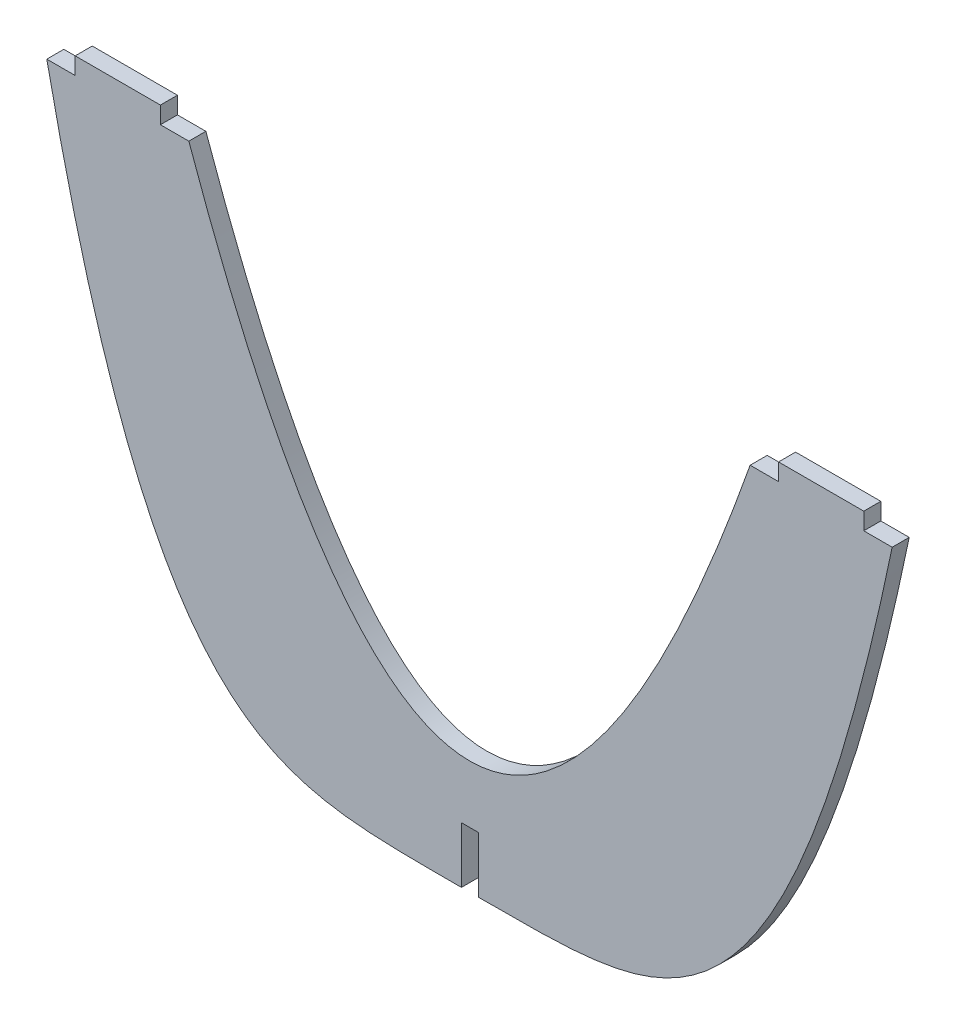
ISO-10303-21;
HEADER;
FILE_DESCRIPTION(('STEP AP214'),'2;1');
FILE_NAME('part.step','',(''),(''),'','','');
FILE_SCHEMA(('AUTOMOTIVE_DESIGN { 1 0 10303 214 1 1 1 1 }'));
ENDSEC;
DATA;
#1=APPLICATION_CONTEXT('core data for automotive mechanical design processes');
#2=APPLICATION_PROTOCOL_DEFINITION('international standard','automotive_design',2000,#1);
#3=PRODUCT_CONTEXT('',#1,'mechanical');
#4=PRODUCT('Part','Part','',(#3));
#5=PRODUCT_RELATED_PRODUCT_CATEGORY('part','',(#4));
#6=PRODUCT_DEFINITION_FORMATION('','',#4);
#7=PRODUCT_DEFINITION_CONTEXT('part definition',#1,'design');
#8=PRODUCT_DEFINITION('design','',#6,#7);
#9=PRODUCT_DEFINITION_SHAPE('','',#8);
#10=(LENGTH_UNIT() NAMED_UNIT(*) SI_UNIT(.MILLI.,.METRE.));
#11=(NAMED_UNIT(*) PLANE_ANGLE_UNIT() SI_UNIT($,.RADIAN.));
#12=(NAMED_UNIT(*) SI_UNIT($,.STERADIAN.) SOLID_ANGLE_UNIT());
#13=UNCERTAINTY_MEASURE_WITH_UNIT(LENGTH_MEASURE(1.E-05),#10,'distance_accuracy_value','');
#14=(GEOMETRIC_REPRESENTATION_CONTEXT(3) GLOBAL_UNCERTAINTY_ASSIGNED_CONTEXT((#13)) GLOBAL_UNIT_ASSIGNED_CONTEXT((#10,
#11,#12)) REPRESENTATION_CONTEXT('',''));
#15=CARTESIAN_POINT('',(0.,0.,0.));
#16=DIRECTION('',(0.,0.,1.));
#17=DIRECTION('',(1.,0.,0.));
#18=AXIS2_PLACEMENT_3D('',#15,#16,#17);
#19=CARTESIAN_POINT('',(-74.4818730679932,89.7662411822127,3.));
#20=CARTESIAN_POINT('',(-37.281873072068,-89.7662411619835,3.));
#21=CARTESIAN_POINT('',(-0.0818730801667343,89.766241141636,3.));
#22=CARTESIAN_POINT('',(37.1181269157585,-89.7662411197392,3.));
#23=CARTESIAN_POINT('',(74.3181269076597,89.7662411010596,3.));
#24=B_SPLINE_CURVE_WITH_KNOTS('',4,(#19,#20,#21,#22,#23),.UNSPECIFIED.,.F.,.F.,(5,5),
(0.0307884857871394,0.969211514104634),.UNSPECIFIED.);
#25=DIRECTION('',(0.,0.,-1.));
#26=VECTOR('',#25,1.);
#27=SURFACE_OF_LINEAR_EXTRUSION('',#24,#26);
#28=DIRECTION('',(0.,0.,1.));
#29=VECTOR('',#28,1.);
#30=CARTESIAN_POINT('',(1.50000000000001,1.83449874206418E-05,-7.));
#31=LINE('',#30,#29);
#32=CARTESIAN_POINT('',(1.50000000000001,1.83449874206418E-05,0.));
#33=VERTEX_POINT('',#32);
#34=CARTESIAN_POINT('',(1.50000000000001,1.83449874206418E-05,3.));
#35=VERTEX_POINT('',#34);
#36=EDGE_CURVE('E59',#33,#35,#31,.T.);
#37=ORIENTED_EDGE('',*,*,#36,.F.);
#38=CARTESIAN_POINT('',(-74.4818730679932,89.7662411822127,0.));
#39=CARTESIAN_POINT('',(-37.281873072068,-89.7662411619835,0.));
#40=CARTESIAN_POINT('',(-0.0818730801667343,89.766241141636,0.));
#41=CARTESIAN_POINT('',(37.1181269157585,-89.7662411197392,0.));
#42=CARTESIAN_POINT('',(74.3181269076597,89.7662411010596,0.));
#43=B_SPLINE_CURVE_WITH_KNOTS('',4,(#38,#39,#40,#41,#42),.UNSPECIFIED.,.F.,.F.,(5,5),
(0.0307884857871394,0.969211514104634),.UNSPECIFIED.);
#44=CARTESIAN_POINT('',(74.3181269080053,89.7662411027273,0.));
#45=VERTEX_POINT('',#44);
#46=EDGE_CURVE('E50',#33,#45,#43,.T.);
#47=ORIENTED_EDGE('',*,*,#46,.T.);
#48=DIRECTION('',(0.,0.,-1.));
#49=VECTOR('',#48,1.);
#50=CARTESIAN_POINT('',(74.3181269080053,89.7662411027273,3.));
#51=LINE('',#50,#49);
#52=CARTESIAN_POINT('',(74.3181269080053,89.7662411027273,3.));
#53=VERTEX_POINT('',#52);
#54=EDGE_CURVE('E378',#53,#45,#51,.T.);
#55=ORIENTED_EDGE('',*,*,#54,.F.);
#56=EDGE_CURVE('E318',#35,#53,#24,.T.);
#57=ORIENTED_EDGE('',*,*,#56,.F.);
#58=EDGE_LOOP('',(#37,#47,#55,#57));
#59=FACE_BOUND('',#58,.T.);
#60=ADVANCED_FACE('F45',(#59),#27,.F.);
#61=CARTESIAN_POINT('',(0.,0.,3.));
#62=DIRECTION('',(0.,0.,1.));
#63=DIRECTION('',(1.,0.,0.));
#64=AXIS2_PLACEMENT_3D('',#61,#62,#63);
#65=PLANE('',#64);
#66=DIRECTION('',(0.,1.,0.));
#67=VECTOR('',#66,1.);
#68=CARTESIAN_POINT('',(1.5,9.87001834498743,3.));
#69=LINE('',#68,#67);
#70=CARTESIAN_POINT('',(1.5,9.87001834498743,3.));
#71=VERTEX_POINT('',#70);
#72=EDGE_CURVE('E11',#35,#71,#69,.T.);
#73=ORIENTED_EDGE('',*,*,#72,.F.);
#74=ORIENTED_EDGE('',*,*,#56,.T.);
#75=DIRECTION('',(-1.,0.,0.));
#76=VECTOR('',#75,1.);
#77=CARTESIAN_POINT('',(0.,89.7662411027273,3.));
#78=LINE('',#77,#76);
#79=CARTESIAN_POINT('',(69.3181269091355,89.7662411027273,3.));
#80=VERTEX_POINT('',#79);
#81=EDGE_CURVE('E323',#53,#80,#78,.T.);
#82=ORIENTED_EDGE('',*,*,#81,.T.);
#83=DIRECTION('',(0.,1.,0.));
#84=VECTOR('',#83,1.);
#85=CARTESIAN_POINT('',(69.3181269091355,0.,3.));
#86=LINE('',#85,#84);
#87=CARTESIAN_POINT('',(69.3181269091355,92.7662411361806,3.));
#88=VERTEX_POINT('',#87);
#89=EDGE_CURVE('E346',#80,#88,#86,.T.);
#90=ORIENTED_EDGE('',*,*,#89,.T.);
#91=DIRECTION('',(-1.,0.,0.));
#92=VECTOR('',#91,1.);
#93=CARTESIAN_POINT('',(0.,92.7662411361805,3.));
#94=LINE('',#93,#92);
#95=CARTESIAN_POINT('',(54.3181269152825,92.7662411361806,3.));
#96=VERTEX_POINT('',#95);
#97=EDGE_CURVE('E337',#88,#96,#94,.T.);
#98=ORIENTED_EDGE('',*,*,#97,.T.);
#99=DIRECTION('',(0.,-1.,0.));
#100=VECTOR('',#99,1.);
#101=CARTESIAN_POINT('',(54.3181269152825,0.,3.));
#102=LINE('',#101,#100);
#103=CARTESIAN_POINT('',(54.3181269152825,89.7662411361806,3.));
#104=VERTEX_POINT('',#103);
#105=EDGE_CURVE('E334',#96,#104,#102,.T.);
#106=ORIENTED_EDGE('',*,*,#105,.T.);
#107=DIRECTION('',(-1.,0.,0.));
#108=VECTOR('',#107,1.);
#109=CARTESIAN_POINT('',(0.,89.7662411361806,3.));
#110=LINE('',#109,#108);
#111=CARTESIAN_POINT('',(49.3181269152825,89.7662411361806,3.));
#112=VERTEX_POINT('',#111);
#113=EDGE_CURVE('E192',#104,#112,#110,.T.);
#114=ORIENTED_EDGE('',*,*,#113,.T.);
#115=CARTESIAN_POINT('',(-49.4818730716867,89.7662412000382,3.));
#116=CARTESIAN_POINT('',(0.027191039267859,-49.7662839097448,3.));
#117=CARTESIAN_POINT('',(49.3181269152825,89.7662411361806,3.));
#118=B_SPLINE_CURVE_WITH_KNOTS('',2,(#115,#116,#117),.UNSPECIFIED.,.F.,.F.,(3,3),(0.,1.),.UNSPECIFIED.);
#119=CARTESIAN_POINT('',(-49.4818730716867,89.7662412000382,3.));
#120=VERTEX_POINT('',#119);
#121=EDGE_CURVE('E174',#120,#112,#118,.T.);
#122=ORIENTED_EDGE('',*,*,#121,.F.);
#123=DIRECTION('',(1.,0.,0.));
#124=VECTOR('',#123,1.);
#125=CARTESIAN_POINT('',(0.,89.7662412000382,3.));
#126=LINE('',#125,#124);
#127=CARTESIAN_POINT('',(-54.4818730716867,89.7662412000382,3.));
#128=VERTEX_POINT('',#127);
#129=EDGE_CURVE('E183',#128,#120,#126,.T.);
#130=ORIENTED_EDGE('',*,*,#129,.F.);
#131=DIRECTION('',(0.,-1.,0.));
#132=VECTOR('',#131,1.);
#133=CARTESIAN_POINT('',(-54.4818730716867,0.,3.));
#134=LINE('',#133,#132);
#135=CARTESIAN_POINT('',(-54.4818730716867,92.7662411833908,3.));
#136=VERTEX_POINT('',#135);
#137=EDGE_CURVE('E182',#136,#128,#134,.T.);
#138=ORIENTED_EDGE('',*,*,#137,.F.);
#139=DIRECTION('',(1.,0.,0.));
#140=VECTOR('',#139,1.);
#141=CARTESIAN_POINT('',(0.,92.7662411833908,3.));
#142=LINE('',#141,#140);
#143=CARTESIAN_POINT('',(-69.481873068232,92.7662411833908,3.));
#144=VERTEX_POINT('',#143);
#145=EDGE_CURVE('E360',#144,#136,#142,.T.);
#146=ORIENTED_EDGE('',*,*,#145,.F.);
#147=DIRECTION('',(0.,1.,0.));
#148=VECTOR('',#147,1.);
#149=CARTESIAN_POINT('',(-69.481873068232,0.,3.));
#150=LINE('',#149,#148);
#151=CARTESIAN_POINT('',(-69.481873068232,89.7662411821999,3.));
#152=VERTEX_POINT('',#151);
#153=EDGE_CURVE('E356',#152,#144,#150,.T.);
#154=ORIENTED_EDGE('',*,*,#153,.F.);
#155=DIRECTION('',(1.,0.,0.));
#156=VECTOR('',#155,1.);
#157=CARTESIAN_POINT('',(0.,89.7662411821999,3.));
#158=LINE('',#157,#156);
#159=CARTESIAN_POINT('',(-74.4818730679906,89.7662411821999,3.));
#160=VERTEX_POINT('',#159);
#161=EDGE_CURVE('E351',#160,#152,#158,.T.);
#162=ORIENTED_EDGE('',*,*,#161,.F.);
#163=CARTESIAN_POINT('',(-1.49999999999999,1.83449874202744E-05,3.));
#164=VERTEX_POINT('',#163);
#165=EDGE_CURVE('E328',#160,#164,#24,.T.);
#166=ORIENTED_EDGE('',*,*,#165,.T.);
#167=DIRECTION('',(0.,-1.,0.));
#168=VECTOR('',#167,1.);
#169=CARTESIAN_POINT('',(-1.5,9.87001834498743,3.));
#170=LINE('',#169,#168);
#171=CARTESIAN_POINT('',(-1.5,9.87001834498743,3.));
#172=VERTEX_POINT('',#171);
#173=EDGE_CURVE('E312',#172,#164,#170,.T.);
#174=ORIENTED_EDGE('',*,*,#173,.F.);
#175=DIRECTION('',(-1.,0.,0.));
#176=VECTOR('',#175,1.);
#177=CARTESIAN_POINT('',(-1.5,9.87001834498743,3.));
#178=LINE('',#177,#176);
#179=EDGE_CURVE('E309',#71,#172,#178,.T.);
#180=ORIENTED_EDGE('',*,*,#179,.F.);
#181=EDGE_LOOP('',(#73,#74,#82,#90,#98,#106,#114,#122,#130,#138,#146,#154,#162,#166,#174,#180));
#182=FACE_BOUND('',#181,.T.);
#183=ADVANCED_FACE('F188',(#182),#65,.T.);
#184=CARTESIAN_POINT('',(0.,0.,0.));
#185=DIRECTION('',(0.,0.,1.));
#186=DIRECTION('',(1.,0.,0.));
#187=AXIS2_PLACEMENT_3D('',#184,#185,#186);
#188=PLANE('',#187);
#189=ORIENTED_EDGE('',*,*,#46,.F.);
#190=DIRECTION('',(0.,1.,0.));
#191=VECTOR('',#190,1.);
#192=CARTESIAN_POINT('',(1.50000000000001,0.,0.));
#193=LINE('',#192,#191);
#194=CARTESIAN_POINT('',(1.5,9.87001834498743,0.));
#195=VERTEX_POINT('',#194);
#196=EDGE_CURVE('E68',#33,#195,#193,.T.);
#197=ORIENTED_EDGE('',*,*,#196,.T.);
#198=DIRECTION('',(-1.,0.,0.));
#199=VECTOR('',#198,1.);
#200=CARTESIAN_POINT('',(0.,9.87001834498743,0.));
#201=LINE('',#200,#199);
#202=CARTESIAN_POINT('',(-1.5,9.87001834498743,0.));
#203=VERTEX_POINT('',#202);
#204=EDGE_CURVE('E290',#195,#203,#201,.T.);
#205=ORIENTED_EDGE('',*,*,#204,.T.);
#206=DIRECTION('',(0.,-1.,0.));
#207=VECTOR('',#206,1.);
#208=CARTESIAN_POINT('',(-1.49999999999999,0.,0.));
#209=LINE('',#208,#207);
#210=CARTESIAN_POINT('',(-1.49999999999999,1.83449874202744E-05,0.));
#211=VERTEX_POINT('',#210);
#212=EDGE_CURVE('E91',#203,#211,#209,.T.);
#213=ORIENTED_EDGE('',*,*,#212,.T.);
#214=CARTESIAN_POINT('',(-74.4818730679906,89.7662411821999,0.));
#215=VERTEX_POINT('',#214);
#216=EDGE_CURVE('E279',#215,#211,#43,.T.);
#217=ORIENTED_EDGE('',*,*,#216,.F.);
#218=DIRECTION('',(1.,0.,0.));
#219=VECTOR('',#218,1.);
#220=CARTESIAN_POINT('',(0.,89.7662411821999,0.));
#221=LINE('',#220,#219);
#222=CARTESIAN_POINT('',(-69.481873068232,89.7662411821999,0.));
#223=VERTEX_POINT('',#222);
#224=EDGE_CURVE('E292',#215,#223,#221,.T.);
#225=ORIENTED_EDGE('',*,*,#224,.T.);
#226=DIRECTION('',(0.,1.,0.));
#227=VECTOR('',#226,1.);
#228=CARTESIAN_POINT('',(-69.481873068232,0.,0.));
#229=LINE('',#228,#227);
#230=CARTESIAN_POINT('',(-69.481873068232,92.7662411833908,0.));
#231=VERTEX_POINT('',#230);
#232=EDGE_CURVE('E296',#223,#231,#229,.T.);
#233=ORIENTED_EDGE('',*,*,#232,.T.);
#234=DIRECTION('',(1.,0.,0.));
#235=VECTOR('',#234,1.);
#236=CARTESIAN_POINT('',(0.,92.7662411833908,0.));
#237=LINE('',#236,#235);
#238=CARTESIAN_POINT('',(-54.4818730716867,92.7662411833908,0.));
#239=VERTEX_POINT('',#238);
#240=EDGE_CURVE('E415',#231,#239,#237,.T.);
#241=ORIENTED_EDGE('',*,*,#240,.T.);
#242=DIRECTION('',(0.,-1.,0.));
#243=VECTOR('',#242,1.);
#244=CARTESIAN_POINT('',(-54.4818730716867,0.,0.));
#245=LINE('',#244,#243);
#246=CARTESIAN_POINT('',(-54.4818730716867,89.7662412000382,0.));
#247=VERTEX_POINT('',#246);
#248=EDGE_CURVE('E419',#239,#247,#245,.T.);
#249=ORIENTED_EDGE('',*,*,#248,.T.);
#250=DIRECTION('',(1.,0.,0.));
#251=VECTOR('',#250,1.);
#252=CARTESIAN_POINT('',(0.,89.7662412000382,0.));
#253=LINE('',#252,#251);
#254=CARTESIAN_POINT('',(-49.4818730716867,89.7662412000382,0.));
#255=VERTEX_POINT('',#254);
#256=EDGE_CURVE('E422',#247,#255,#253,.T.);
#257=ORIENTED_EDGE('',*,*,#256,.T.);
#258=CARTESIAN_POINT('',(-49.4818730716867,89.7662412000382,0.));
#259=CARTESIAN_POINT('',(0.027191039267859,-49.7662839097448,0.));
#260=CARTESIAN_POINT('',(49.3181269152825,89.7662411361806,0.));
#261=B_SPLINE_CURVE_WITH_KNOTS('',2,(#258,#259,#260),.UNSPECIFIED.,.F.,.F.,(3,3),(0.,1.),.UNSPECIFIED.);
#262=CARTESIAN_POINT('',(49.3181269152825,89.7662411361806,0.));
#263=VERTEX_POINT('',#262);
#264=EDGE_CURVE('E176',#255,#263,#261,.T.);
#265=ORIENTED_EDGE('',*,*,#264,.T.);
#266=DIRECTION('',(-1.,0.,0.));
#267=VECTOR('',#266,1.);
#268=CARTESIAN_POINT('',(0.,89.7662411361806,0.));
#269=LINE('',#268,#267);
#270=CARTESIAN_POINT('',(54.3181269152825,89.7662411361806,0.));
#271=VERTEX_POINT('',#270);
#272=EDGE_CURVE('E397',#271,#263,#269,.T.);
#273=ORIENTED_EDGE('',*,*,#272,.F.);
#274=DIRECTION('',(0.,-1.,0.));
#275=VECTOR('',#274,1.);
#276=CARTESIAN_POINT('',(54.3181269152825,0.,0.));
#277=LINE('',#276,#275);
#278=CARTESIAN_POINT('',(54.3181269152825,92.7662411361806,0.));
#279=VERTEX_POINT('',#278);
#280=EDGE_CURVE('E392',#279,#271,#277,.T.);
#281=ORIENTED_EDGE('',*,*,#280,.F.);
#282=DIRECTION('',(-1.,0.,0.));
#283=VECTOR('',#282,1.);
#284=CARTESIAN_POINT('',(0.,92.7662411361805,0.));
#285=LINE('',#284,#283);
#286=CARTESIAN_POINT('',(69.3181269091355,92.7662411361806,0.));
#287=VERTEX_POINT('',#286);
#288=EDGE_CURVE('E387',#287,#279,#285,.T.);
#289=ORIENTED_EDGE('',*,*,#288,.F.);
#290=DIRECTION('',(0.,1.,0.));
#291=VECTOR('',#290,1.);
#292=CARTESIAN_POINT('',(69.3181269091355,0.,0.));
#293=LINE('',#292,#291);
#294=CARTESIAN_POINT('',(69.3181269091355,89.7662411027273,0.));
#295=VERTEX_POINT('',#294);
#296=EDGE_CURVE('E382',#295,#287,#293,.T.);
#297=ORIENTED_EDGE('',*,*,#296,.F.);
#298=DIRECTION('',(-1.,0.,0.));
#299=VECTOR('',#298,1.);
#300=CARTESIAN_POINT('',(0.,89.7662411027273,0.));
#301=LINE('',#300,#299);
#302=EDGE_CURVE('E377',#45,#295,#301,.T.);
#303=ORIENTED_EDGE('',*,*,#302,.F.);
#304=EDGE_LOOP('',(#189,#197,#205,#213,#217,#225,#233,#241,#249,#257,#265,#273,#281,#289,#297,#303));
#305=FACE_BOUND('',#304,.T.);
#306=ADVANCED_FACE('F217',(#305),#188,.F.);
#307=DIRECTION('',(0.,0.,-1.));
#308=VECTOR('',#307,1.);
#309=SURFACE_OF_LINEAR_EXTRUSION('',#118,#308);
#310=ORIENTED_EDGE('',*,*,#264,.F.);
#311=DIRECTION('',(0.,0.,-1.));
#312=VECTOR('',#311,1.);
#313=CARTESIAN_POINT('',(-49.4818730716867,89.7662412000382,3.));
#314=LINE('',#313,#312);
#315=EDGE_CURVE('E171',#120,#255,#314,.T.);
#316=ORIENTED_EDGE('',*,*,#315,.F.);
#317=ORIENTED_EDGE('',*,*,#121,.T.);
#318=DIRECTION('',(0.,0.,-1.));
#319=VECTOR('',#318,1.);
#320=CARTESIAN_POINT('',(49.3181269152825,89.7662411361806,3.));
#321=LINE('',#320,#319);
#322=EDGE_CURVE('E195',#112,#263,#321,.T.);
#323=ORIENTED_EDGE('',*,*,#322,.T.);
#324=EDGE_LOOP('',(#310,#316,#317,#323));
#325=FACE_BOUND('',#324,.T.);
#326=ADVANCED_FACE('F173',(#325),#309,.T.);
#327=CARTESIAN_POINT('',(0.,89.7662412000382,3.));
#328=DIRECTION('',(0.,1.,0.));
#329=DIRECTION('',(0.,0.,1.));
#330=AXIS2_PLACEMENT_3D('',#327,#328,#329);
#331=PLANE('',#330);
#332=ORIENTED_EDGE('',*,*,#256,.F.);
#333=DIRECTION('',(0.,0.,-1.));
#334=VECTOR('',#333,1.);
#335=CARTESIAN_POINT('',(-54.4818730716867,89.7662412000382,3.));
#336=LINE('',#335,#334);
#337=EDGE_CURVE('E198',#128,#247,#336,.T.);
#338=ORIENTED_EDGE('',*,*,#337,.F.);
#339=ORIENTED_EDGE('',*,*,#129,.T.);
#340=ORIENTED_EDGE('',*,*,#315,.T.);
#341=EDGE_LOOP('',(#332,#338,#339,#340));
#342=FACE_BOUND('',#341,.T.);
#343=ADVANCED_FACE('F197',(#342),#331,.T.);
#344=CARTESIAN_POINT('',(-54.4818730716867,0.,3.));
#345=DIRECTION('',(1.,0.,0.));
#346=DIRECTION('',(0.,0.,-1.));
#347=AXIS2_PLACEMENT_3D('',#344,#345,#346);
#348=PLANE('',#347);
#349=ORIENTED_EDGE('',*,*,#248,.F.);
#350=DIRECTION('',(0.,0.,-1.));
#351=VECTOR('',#350,1.);
#352=CARTESIAN_POINT('',(-54.4818730716867,92.7662411833908,3.));
#353=LINE('',#352,#351);
#354=EDGE_CURVE('E359',#136,#239,#353,.T.);
#355=ORIENTED_EDGE('',*,*,#354,.F.);
#356=ORIENTED_EDGE('',*,*,#137,.T.);
#357=ORIENTED_EDGE('',*,*,#337,.T.);
#358=EDGE_LOOP('',(#349,#355,#356,#357));
#359=FACE_BOUND('',#358,.T.);
#360=ADVANCED_FACE('F220',(#359),#348,.T.);
#361=CARTESIAN_POINT('',(0.,92.7662411833908,3.));
#362=DIRECTION('',(0.,1.,0.));
#363=DIRECTION('',(0.,0.,1.));
#364=AXIS2_PLACEMENT_3D('',#361,#362,#363);
#365=PLANE('',#364);
#366=ORIENTED_EDGE('',*,*,#240,.F.);
#367=DIRECTION('',(0.,0.,-1.));
#368=VECTOR('',#367,1.);
#369=CARTESIAN_POINT('',(-69.481873068232,92.7662411833908,3.));
#370=LINE('',#369,#368);
#371=EDGE_CURVE('E355',#144,#231,#370,.T.);
#372=ORIENTED_EDGE('',*,*,#371,.F.);
#373=ORIENTED_EDGE('',*,*,#145,.T.);
#374=ORIENTED_EDGE('',*,*,#354,.T.);
#375=EDGE_LOOP('',(#366,#372,#373,#374));
#376=FACE_BOUND('',#375,.T.);
#377=ADVANCED_FACE('F223',(#376),#365,.T.);
#378=CARTESIAN_POINT('',(-69.481873068232,0.,3.));
#379=DIRECTION('',(-1.,0.,0.));
#380=DIRECTION('',(0.,0.,1.));
#381=AXIS2_PLACEMENT_3D('',#378,#379,#380);
#382=PLANE('',#381);
#383=ORIENTED_EDGE('',*,*,#232,.F.);
#384=DIRECTION('',(0.,0.,-1.));
#385=VECTOR('',#384,1.);
#386=CARTESIAN_POINT('',(-69.481873068232,89.7662411821999,3.));
#387=LINE('',#386,#385);
#388=EDGE_CURVE('E286',#152,#223,#387,.T.);
#389=ORIENTED_EDGE('',*,*,#388,.F.);
#390=ORIENTED_EDGE('',*,*,#153,.T.);
#391=ORIENTED_EDGE('',*,*,#371,.T.);
#392=EDGE_LOOP('',(#383,#389,#390,#391));
#393=FACE_BOUND('',#392,.T.);
#394=ADVANCED_FACE('F227',(#393),#382,.T.);
#395=CARTESIAN_POINT('',(0.,89.7662411821999,3.));
#396=DIRECTION('',(0.,1.,0.));
#397=DIRECTION('',(0.,0.,1.));
#398=AXIS2_PLACEMENT_3D('',#395,#396,#397);
#399=PLANE('',#398);
#400=ORIENTED_EDGE('',*,*,#224,.F.);
#401=DIRECTION('',(0.,0.,-1.));
#402=VECTOR('',#401,1.);
#403=CARTESIAN_POINT('',(-74.4818730679906,89.7662411821999,3.));
#404=LINE('',#403,#402);
#405=EDGE_CURVE('E282',#160,#215,#404,.T.);
#406=ORIENTED_EDGE('',*,*,#405,.F.);
#407=ORIENTED_EDGE('',*,*,#161,.T.);
#408=ORIENTED_EDGE('',*,*,#388,.T.);
#409=EDGE_LOOP('',(#400,#406,#407,#408));
#410=FACE_BOUND('',#409,.T.);
#411=ADVANCED_FACE('F231',(#410),#399,.T.);
#412=ORIENTED_EDGE('',*,*,#216,.T.);
#413=DIRECTION('',(0.,0.,1.));
#414=VECTOR('',#413,1.);
#415=CARTESIAN_POINT('',(-1.49999999999999,1.83449874202744E-05,-7.));
#416=LINE('',#415,#414);
#417=EDGE_CURVE('E96',#211,#164,#416,.T.);
#418=ORIENTED_EDGE('',*,*,#417,.T.);
#419=ORIENTED_EDGE('',*,*,#165,.F.);
#420=ORIENTED_EDGE('',*,*,#405,.T.);
#421=EDGE_LOOP('',(#412,#418,#419,#420));
#422=FACE_BOUND('',#421,.T.);
#423=ADVANCED_FACE('F47',(#422),#27,.F.);
#424=CARTESIAN_POINT('',(0.,89.7662411027273,3.));
#425=DIRECTION('',(0.,-1.,0.));
#426=DIRECTION('',(0.,0.,-1.));
#427=AXIS2_PLACEMENT_3D('',#424,#425,#426);
#428=PLANE('',#427);
#429=ORIENTED_EDGE('',*,*,#302,.T.);
#430=DIRECTION('',(0.,0.,-1.));
#431=VECTOR('',#430,1.);
#432=CARTESIAN_POINT('',(69.3181269091355,89.7662411027273,3.));
#433=LINE('',#432,#431);
#434=EDGE_CURVE('E383',#80,#295,#433,.T.);
#435=ORIENTED_EDGE('',*,*,#434,.F.);
#436=ORIENTED_EDGE('',*,*,#81,.F.);
#437=ORIENTED_EDGE('',*,*,#54,.T.);
#438=EDGE_LOOP('',(#429,#435,#436,#437));
#439=FACE_BOUND('',#438,.T.);
#440=ADVANCED_FACE('F236',(#439),#428,.F.);
#441=CARTESIAN_POINT('',(69.3181269091355,0.,3.));
#442=DIRECTION('',(-1.,0.,0.));
#443=DIRECTION('',(0.,0.,1.));
#444=AXIS2_PLACEMENT_3D('',#441,#442,#443);
#445=PLANE('',#444);
#446=ORIENTED_EDGE('',*,*,#296,.T.);
#447=DIRECTION('',(0.,0.,-1.));
#448=VECTOR('',#447,1.);
#449=CARTESIAN_POINT('',(69.3181269091355,92.7662411361806,3.));
#450=LINE('',#449,#448);
#451=EDGE_CURVE('E388',#88,#287,#450,.T.);
#452=ORIENTED_EDGE('',*,*,#451,.F.);
#453=ORIENTED_EDGE('',*,*,#89,.F.);
#454=ORIENTED_EDGE('',*,*,#434,.T.);
#455=EDGE_LOOP('',(#446,#452,#453,#454));
#456=FACE_BOUND('',#455,.T.);
#457=ADVANCED_FACE('F239',(#456),#445,.F.);
#458=CARTESIAN_POINT('',(0.,92.7662411361805,3.));
#459=DIRECTION('',(0.,-1.,0.));
#460=DIRECTION('',(1.,0.,0.));
#461=AXIS2_PLACEMENT_3D('',#458,#459,#460);
#462=PLANE('',#461);
#463=ORIENTED_EDGE('',*,*,#288,.T.);
#464=DIRECTION('',(0.,0.,-1.));
#465=VECTOR('',#464,1.);
#466=CARTESIAN_POINT('',(54.3181269152825,92.7662411361806,3.));
#467=LINE('',#466,#465);
#468=EDGE_CURVE('E393',#96,#279,#467,.T.);
#469=ORIENTED_EDGE('',*,*,#468,.F.);
#470=ORIENTED_EDGE('',*,*,#97,.F.);
#471=ORIENTED_EDGE('',*,*,#451,.T.);
#472=EDGE_LOOP('',(#463,#469,#470,#471));
#473=FACE_BOUND('',#472,.T.);
#474=ADVANCED_FACE('F243',(#473),#462,.F.);
#475=CARTESIAN_POINT('',(54.3181269152825,0.,3.));
#476=DIRECTION('',(1.,0.,0.));
#477=DIRECTION('',(0.,0.,-1.));
#478=AXIS2_PLACEMENT_3D('',#475,#476,#477);
#479=PLANE('',#478);
#480=ORIENTED_EDGE('',*,*,#280,.T.);
#481=DIRECTION('',(0.,0.,-1.));
#482=VECTOR('',#481,1.);
#483=CARTESIAN_POINT('',(54.3181269152825,89.7662411361806,3.));
#484=LINE('',#483,#482);
#485=EDGE_CURVE('E316',#104,#271,#484,.T.);
#486=ORIENTED_EDGE('',*,*,#485,.F.);
#487=ORIENTED_EDGE('',*,*,#105,.F.);
#488=ORIENTED_EDGE('',*,*,#468,.T.);
#489=EDGE_LOOP('',(#480,#486,#487,#488));
#490=FACE_BOUND('',#489,.T.);
#491=ADVANCED_FACE('F247',(#490),#479,.F.);
#492=CARTESIAN_POINT('',(0.,89.7662411361806,3.));
#493=DIRECTION('',(0.,-1.,0.));
#494=DIRECTION('',(0.,0.,-1.));
#495=AXIS2_PLACEMENT_3D('',#492,#493,#494);
#496=PLANE('',#495);
#497=ORIENTED_EDGE('',*,*,#272,.T.);
#498=ORIENTED_EDGE('',*,*,#322,.F.);
#499=ORIENTED_EDGE('',*,*,#113,.F.);
#500=ORIENTED_EDGE('',*,*,#485,.T.);
#501=EDGE_LOOP('',(#497,#498,#499,#500));
#502=FACE_BOUND('',#501,.T.);
#503=ADVANCED_FACE('F251',(#502),#496,.F.);
#504=CARTESIAN_POINT('',(-1.5,9.87001834498743,-7.));
#505=DIRECTION('',(-1.,0.,0.));
#506=DIRECTION('',(0.,-1.,0.));
#507=AXIS2_PLACEMENT_3D('',#504,#505,#506);
#508=PLANE('',#507);
#509=DIRECTION('',(0.,0.,1.));
#510=VECTOR('',#509,1.);
#511=CARTESIAN_POINT('',(-1.5,9.87001834498743,-7.));
#512=LINE('',#511,#510);
#513=EDGE_CURVE('E313',#203,#172,#512,.T.);
#514=ORIENTED_EDGE('',*,*,#513,.T.);
#515=ORIENTED_EDGE('',*,*,#173,.T.);
#516=ORIENTED_EDGE('',*,*,#417,.F.);
#517=ORIENTED_EDGE('',*,*,#212,.F.);
#518=EDGE_LOOP('',(#514,#515,#516,#517));
#519=FACE_BOUND('',#518,.T.);
#520=ADVANCED_FACE('F255',(#519),#508,.F.);
#521=CARTESIAN_POINT('',(-1.5,9.87001834498743,-7.));
#522=DIRECTION('',(0.,1.,0.));
#523=DIRECTION('',(0.,0.,1.));
#524=AXIS2_PLACEMENT_3D('',#521,#522,#523);
#525=PLANE('',#524);
#526=DIRECTION('',(0.,0.,1.));
#527=VECTOR('',#526,1.);
#528=CARTESIAN_POINT('',(1.5,9.87001834498743,-7.));
#529=LINE('',#528,#527);
#530=EDGE_CURVE('E84',#195,#71,#529,.T.);
#531=ORIENTED_EDGE('',*,*,#530,.T.);
#532=ORIENTED_EDGE('',*,*,#179,.T.);
#533=ORIENTED_EDGE('',*,*,#513,.F.);
#534=ORIENTED_EDGE('',*,*,#204,.F.);
#535=EDGE_LOOP('',(#531,#532,#533,#534));
#536=FACE_BOUND('',#535,.T.);
#537=ADVANCED_FACE('F264',(#536),#525,.F.);
#538=CARTESIAN_POINT('',(1.5,9.87001834498743,-7.));
#539=DIRECTION('',(1.,0.,0.));
#540=DIRECTION('',(0.,1.,0.));
#541=AXIS2_PLACEMENT_3D('',#538,#539,#540);
#542=PLANE('',#541);
#543=ORIENTED_EDGE('',*,*,#36,.T.);
#544=ORIENTED_EDGE('',*,*,#72,.T.);
#545=ORIENTED_EDGE('',*,*,#530,.F.);
#546=ORIENTED_EDGE('',*,*,#196,.F.);
#547=EDGE_LOOP('',(#543,#544,#545,#546));
#548=FACE_BOUND('',#547,.T.);
#549=ADVANCED_FACE('F265',(#548),#542,.F.);
#550=CLOSED_SHELL('',(#60,#183,#306,#326,#343,#360,#377,#394,#411,#423,#440,#457,#474,#491,#503,
#520,#537,#549));
#551=MANIFOLD_SOLID_BREP('B2',#550);
#552=ADVANCED_BREP_SHAPE_REPRESENTATION('',(#18,#551),#14);
#553=SHAPE_DEFINITION_REPRESENTATION(#9,#552);
ENDSEC;
END-ISO-10303-21;
